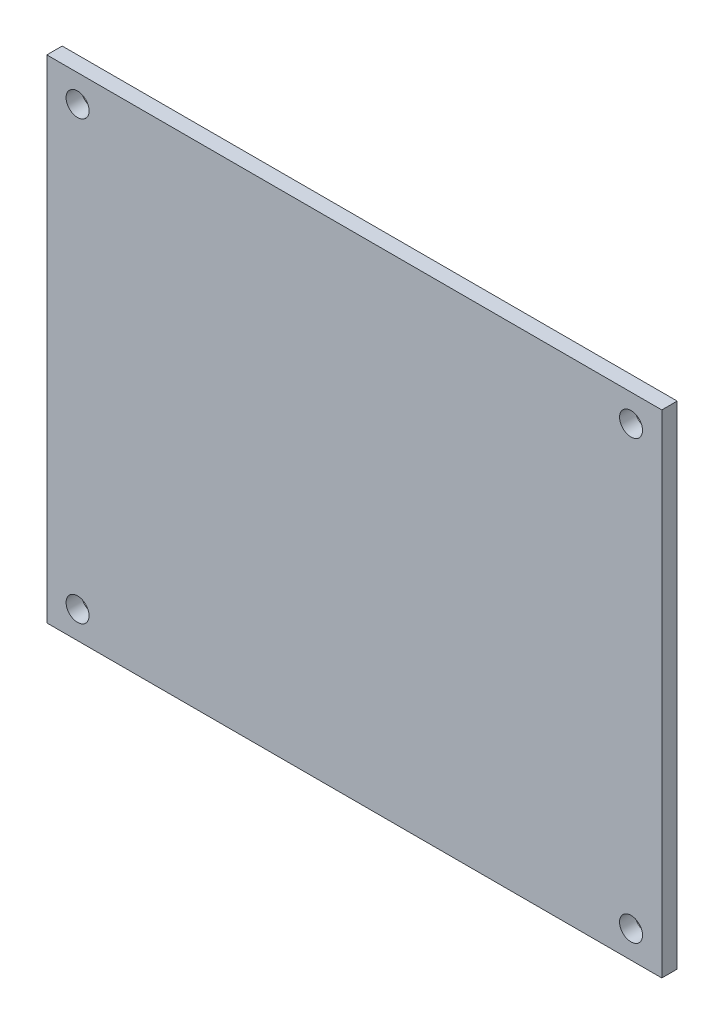
ISO-10303-21;
HEADER;
FILE_DESCRIPTION(('STEP AP214'),'2;1');
FILE_NAME('part.step','',(''),(''),'','','');
FILE_SCHEMA(('AUTOMOTIVE_DESIGN { 1 0 10303 214 1 1 1 1 }'));
ENDSEC;
DATA;
#1=APPLICATION_CONTEXT('core data for automotive mechanical design processes');
#2=APPLICATION_PROTOCOL_DEFINITION('international standard','automotive_design',2000,#1);
#3=PRODUCT_CONTEXT('',#1,'mechanical');
#4=PRODUCT('Part','Part','',(#3));
#5=PRODUCT_RELATED_PRODUCT_CATEGORY('part','',(#4));
#6=PRODUCT_DEFINITION_FORMATION('','',#4);
#7=PRODUCT_DEFINITION_CONTEXT('part definition',#1,'design');
#8=PRODUCT_DEFINITION('design','',#6,#7);
#9=PRODUCT_DEFINITION_SHAPE('','',#8);
#10=(LENGTH_UNIT() NAMED_UNIT(*) SI_UNIT(.MILLI.,.METRE.));
#11=(NAMED_UNIT(*) PLANE_ANGLE_UNIT() SI_UNIT($,.RADIAN.));
#12=(NAMED_UNIT(*) SI_UNIT($,.STERADIAN.) SOLID_ANGLE_UNIT());
#13=UNCERTAINTY_MEASURE_WITH_UNIT(LENGTH_MEASURE(1.E-05),#10,'distance_accuracy_value','');
#14=(GEOMETRIC_REPRESENTATION_CONTEXT(3) GLOBAL_UNCERTAINTY_ASSIGNED_CONTEXT((#13)) GLOBAL_UNIT_ASSIGNED_CONTEXT((#10,
#11,#12)) REPRESENTATION_CONTEXT('',''));
#15=CARTESIAN_POINT('',(0.,0.,0.));
#16=DIRECTION('',(0.,0.,1.));
#17=DIRECTION('',(1.,0.,0.));
#18=AXIS2_PLACEMENT_3D('',#15,#16,#17);
#19=CARTESIAN_POINT('',(127.,101.6,6.35));
#20=DIRECTION('',(-1.,0.,0.));
#21=DIRECTION('',(0.,-1.,0.));
#22=AXIS2_PLACEMENT_3D('',#19,#20,#21);
#23=PLANE('',#22);
#24=DIRECTION('',(0.,1.,0.));
#25=VECTOR('',#24,1.);
#26=CARTESIAN_POINT('',(127.,101.6,0.));
#27=LINE('',#26,#25);
#28=CARTESIAN_POINT('',(127.,-101.6,0.));
#29=VERTEX_POINT('',#28);
#30=CARTESIAN_POINT('',(127.,101.6,0.));
#31=VERTEX_POINT('',#30);
#32=EDGE_CURVE('E113',#29,#31,#27,.T.);
#33=ORIENTED_EDGE('',*,*,#32,.T.);
#34=DIRECTION('',(0.,0.,-1.));
#35=VECTOR('',#34,1.);
#36=CARTESIAN_POINT('',(127.,101.6,6.35));
#37=LINE('',#36,#35);
#38=CARTESIAN_POINT('',(127.,101.6,6.35));
#39=VERTEX_POINT('',#38);
#40=EDGE_CURVE('E11',#39,#31,#37,.T.);
#41=ORIENTED_EDGE('',*,*,#40,.F.);
#42=DIRECTION('',(0.,1.,0.));
#43=VECTOR('',#42,1.);
#44=CARTESIAN_POINT('',(127.,101.6,6.35));
#45=LINE('',#44,#43);
#46=CARTESIAN_POINT('',(127.,-101.6,6.35));
#47=VERTEX_POINT('',#46);
#48=EDGE_CURVE('E97',#47,#39,#45,.T.);
#49=ORIENTED_EDGE('',*,*,#48,.F.);
#50=DIRECTION('',(0.,0.,-1.));
#51=VECTOR('',#50,1.);
#52=CARTESIAN_POINT('',(127.,-101.6,6.35));
#53=LINE('',#52,#51);
#54=EDGE_CURVE('E112',#47,#29,#53,.T.);
#55=ORIENTED_EDGE('',*,*,#54,.T.);
#56=EDGE_LOOP('',(#33,#41,#49,#55));
#57=FACE_BOUND('',#56,.T.);
#58=ADVANCED_FACE('F50',(#57),#23,.F.);
#59=CARTESIAN_POINT('',(-127.,101.6,6.35));
#60=DIRECTION('',(0.,-1.,0.));
#61=DIRECTION('',(0.,0.,-1.));
#62=AXIS2_PLACEMENT_3D('',#59,#60,#61);
#63=PLANE('',#62);
#64=DIRECTION('',(-1.,0.,0.));
#65=VECTOR('',#64,1.);
#66=CARTESIAN_POINT('',(-127.,101.6,0.));
#67=LINE('',#66,#65);
#68=CARTESIAN_POINT('',(-127.,101.6,0.));
#69=VERTEX_POINT('',#68);
#70=EDGE_CURVE('E102',#31,#69,#67,.T.);
#71=ORIENTED_EDGE('',*,*,#70,.T.);
#72=DIRECTION('',(0.,0.,-1.));
#73=VECTOR('',#72,1.);
#74=CARTESIAN_POINT('',(-127.,101.6,6.35));
#75=LINE('',#74,#73);
#76=CARTESIAN_POINT('',(-127.,101.6,6.35));
#77=VERTEX_POINT('',#76);
#78=EDGE_CURVE('E57',#77,#69,#75,.T.);
#79=ORIENTED_EDGE('',*,*,#78,.F.);
#80=DIRECTION('',(-1.,0.,0.));
#81=VECTOR('',#80,1.);
#82=CARTESIAN_POINT('',(-127.,101.6,6.35));
#83=LINE('',#82,#81);
#84=EDGE_CURVE('E94',#39,#77,#83,.T.);
#85=ORIENTED_EDGE('',*,*,#84,.F.);
#86=ORIENTED_EDGE('',*,*,#40,.T.);
#87=EDGE_LOOP('',(#71,#79,#85,#86));
#88=FACE_BOUND('',#87,.T.);
#89=ADVANCED_FACE('F103',(#88),#63,.F.);
#90=CARTESIAN_POINT('',(-127.,101.6,6.35));
#91=DIRECTION('',(1.,0.,0.));
#92=DIRECTION('',(0.,0.,-1.));
#93=AXIS2_PLACEMENT_3D('',#90,#91,#92);
#94=PLANE('',#93);
#95=DIRECTION('',(0.,-1.,0.));
#96=VECTOR('',#95,1.);
#97=CARTESIAN_POINT('',(-127.,101.6,0.));
#98=LINE('',#97,#96);
#99=CARTESIAN_POINT('',(-127.,-101.6,0.));
#100=VERTEX_POINT('',#99);
#101=EDGE_CURVE('E81',#69,#100,#98,.T.);
#102=ORIENTED_EDGE('',*,*,#101,.T.);
#103=DIRECTION('',(0.,0.,-1.));
#104=VECTOR('',#103,1.);
#105=CARTESIAN_POINT('',(-127.,-101.6,6.35));
#106=LINE('',#105,#104);
#107=CARTESIAN_POINT('',(-127.,-101.6,6.35));
#108=VERTEX_POINT('',#107);
#109=EDGE_CURVE('E106',#108,#100,#106,.T.);
#110=ORIENTED_EDGE('',*,*,#109,.F.);
#111=DIRECTION('',(0.,-1.,0.));
#112=VECTOR('',#111,1.);
#113=CARTESIAN_POINT('',(-127.,101.6,6.35));
#114=LINE('',#113,#112);
#115=EDGE_CURVE('E100',#77,#108,#114,.T.);
#116=ORIENTED_EDGE('',*,*,#115,.F.);
#117=ORIENTED_EDGE('',*,*,#78,.T.);
#118=EDGE_LOOP('',(#102,#110,#116,#117));
#119=FACE_BOUND('',#118,.T.);
#120=ADVANCED_FACE('F110',(#119),#94,.F.);
#121=CARTESIAN_POINT('',(-127.,-101.6,6.35));
#122=DIRECTION('',(0.,1.,0.));
#123=DIRECTION('',(0.,0.,1.));
#124=AXIS2_PLACEMENT_3D('',#121,#122,#123);
#125=PLANE('',#124);
#126=DIRECTION('',(1.,0.,0.));
#127=VECTOR('',#126,1.);
#128=CARTESIAN_POINT('',(-127.,-101.6,0.));
#129=LINE('',#128,#127);
#130=EDGE_CURVE('E87',#100,#29,#129,.T.);
#131=ORIENTED_EDGE('',*,*,#130,.T.);
#132=ORIENTED_EDGE('',*,*,#54,.F.);
#133=DIRECTION('',(1.,0.,0.));
#134=VECTOR('',#133,1.);
#135=CARTESIAN_POINT('',(-127.,-101.6,6.35));
#136=LINE('',#135,#134);
#137=EDGE_CURVE('E63',#108,#47,#136,.T.);
#138=ORIENTED_EDGE('',*,*,#137,.F.);
#139=ORIENTED_EDGE('',*,*,#109,.T.);
#140=EDGE_LOOP('',(#131,#132,#138,#139));
#141=FACE_BOUND('',#140,.T.);
#142=ADVANCED_FACE('F129',(#141),#125,.F.);
#143=CARTESIAN_POINT('',(0.,0.,6.35));
#144=DIRECTION('',(0.,0.,1.));
#145=DIRECTION('',(1.,0.,0.));
#146=AXIS2_PLACEMENT_3D('',#143,#144,#145);
#147=PLANE('',#146);
#148=CARTESIAN_POINT('',(-114.3,-90.297,6.35));
#149=DIRECTION('',(0.,0.,1.));
#150=DIRECTION('',(-1.,0.,0.));
#151=AXIS2_PLACEMENT_3D('',#148,#149,#150);
#152=CIRCLE('',#151,4.74979999999999);
#153=CARTESIAN_POINT('',(-119.0498,-90.297,6.35));
#154=VERTEX_POINT('',#153);
#155=EDGE_CURVE('E139',#154,#154,#152,.T.);
#156=ORIENTED_EDGE('',*,*,#155,.F.);
#157=EDGE_LOOP('',(#156));
#158=FACE_BOUND('',#157,.T.);
#159=CARTESIAN_POINT('',(114.3,90.297,6.35));
#160=DIRECTION('',(0.,0.,1.));
#161=DIRECTION('',(-1.,0.,0.));
#162=AXIS2_PLACEMENT_3D('',#159,#160,#161);
#163=CIRCLE('',#162,4.74979999999999);
#164=CARTESIAN_POINT('',(109.5502,90.297,6.35));
#165=VERTEX_POINT('',#164);
#166=EDGE_CURVE('E146',#165,#165,#163,.T.);
#167=ORIENTED_EDGE('',*,*,#166,.F.);
#168=EDGE_LOOP('',(#167));
#169=FACE_BOUND('',#168,.T.);
#170=CARTESIAN_POINT('',(-114.3,90.297,6.35));
#171=DIRECTION('',(0.,0.,1.));
#172=DIRECTION('',(1.,0.,0.));
#173=AXIS2_PLACEMENT_3D('',#170,#171,#172);
#174=CIRCLE('',#173,4.74979999999999);
#175=CARTESIAN_POINT('',(-109.5502,90.297,6.35));
#176=VERTEX_POINT('',#175);
#177=EDGE_CURVE('E149',#176,#176,#174,.T.);
#178=ORIENTED_EDGE('',*,*,#177,.F.);
#179=EDGE_LOOP('',(#178));
#180=FACE_BOUND('',#179,.T.);
#181=CARTESIAN_POINT('',(114.3,-90.297,6.35));
#182=DIRECTION('',(0.,0.,1.));
#183=DIRECTION('',(1.,0.,0.));
#184=AXIS2_PLACEMENT_3D('',#181,#182,#183);
#185=CIRCLE('',#184,4.74979999999999);
#186=CARTESIAN_POINT('',(119.0498,-90.297,6.35));
#187=VERTEX_POINT('',#186);
#188=EDGE_CURVE('E136',#187,#187,#185,.T.);
#189=ORIENTED_EDGE('',*,*,#188,.F.);
#190=EDGE_LOOP('',(#189));
#191=FACE_BOUND('',#190,.T.);
#192=ORIENTED_EDGE('',*,*,#48,.T.);
#193=ORIENTED_EDGE('',*,*,#84,.T.);
#194=ORIENTED_EDGE('',*,*,#115,.T.);
#195=ORIENTED_EDGE('',*,*,#137,.T.);
#196=EDGE_LOOP('',(#192,#193,#194,#195));
#197=FACE_BOUND('',#196,.T.);
#198=ADVANCED_FACE('F92',(#158,#169,#180,#191,#197),#147,.T.);
#199=CARTESIAN_POINT('',(0.,0.,0.));
#200=DIRECTION('',(0.,0.,1.));
#201=DIRECTION('',(1.,0.,0.));
#202=AXIS2_PLACEMENT_3D('',#199,#200,#201);
#203=PLANE('',#202);
#204=CARTESIAN_POINT('',(-114.3,-90.297,0.));
#205=DIRECTION('',(0.,0.,1.));
#206=DIRECTION('',(-1.,0.,0.));
#207=AXIS2_PLACEMENT_3D('',#204,#205,#206);
#208=CIRCLE('',#207,4.74979999999999);
#209=CARTESIAN_POINT('',(-119.0498,-90.297,0.));
#210=VERTEX_POINT('',#209);
#211=EDGE_CURVE('E153',#210,#210,#208,.T.);
#212=ORIENTED_EDGE('',*,*,#211,.T.);
#213=EDGE_LOOP('',(#212));
#214=FACE_BOUND('',#213,.T.);
#215=CARTESIAN_POINT('',(114.3,90.297,0.));
#216=DIRECTION('',(0.,0.,1.));
#217=DIRECTION('',(-1.,0.,0.));
#218=AXIS2_PLACEMENT_3D('',#215,#216,#217);
#219=CIRCLE('',#218,4.74979999999999);
#220=CARTESIAN_POINT('',(109.5502,90.297,0.));
#221=VERTEX_POINT('',#220);
#222=EDGE_CURVE('E145',#221,#221,#219,.T.);
#223=ORIENTED_EDGE('',*,*,#222,.T.);
#224=EDGE_LOOP('',(#223));
#225=FACE_BOUND('',#224,.T.);
#226=CARTESIAN_POINT('',(-114.3,90.297,0.));
#227=DIRECTION('',(0.,0.,1.));
#228=DIRECTION('',(1.,0.,0.));
#229=AXIS2_PLACEMENT_3D('',#226,#227,#228);
#230=CIRCLE('',#229,4.74979999999999);
#231=CARTESIAN_POINT('',(-109.5502,90.297,0.));
#232=VERTEX_POINT('',#231);
#233=EDGE_CURVE('E159',#232,#232,#230,.T.);
#234=ORIENTED_EDGE('',*,*,#233,.T.);
#235=EDGE_LOOP('',(#234));
#236=FACE_BOUND('',#235,.T.);
#237=CARTESIAN_POINT('',(114.3,-90.297,0.));
#238=DIRECTION('',(0.,0.,1.));
#239=DIRECTION('',(1.,0.,0.));
#240=AXIS2_PLACEMENT_3D('',#237,#238,#239);
#241=CIRCLE('',#240,4.74979999999999);
#242=CARTESIAN_POINT('',(119.0498,-90.297,0.));
#243=VERTEX_POINT('',#242);
#244=EDGE_CURVE('E118',#243,#243,#241,.T.);
#245=ORIENTED_EDGE('',*,*,#244,.T.);
#246=EDGE_LOOP('',(#245));
#247=FACE_BOUND('',#246,.T.);
#248=ORIENTED_EDGE('',*,*,#32,.F.);
#249=ORIENTED_EDGE('',*,*,#130,.F.);
#250=ORIENTED_EDGE('',*,*,#101,.F.);
#251=ORIENTED_EDGE('',*,*,#70,.F.);
#252=EDGE_LOOP('',(#248,#249,#250,#251));
#253=FACE_BOUND('',#252,.T.);
#254=ADVANCED_FACE('F135',(#214,#225,#236,#247,#253),#203,.F.);
#255=CARTESIAN_POINT('',(114.3,-90.297,0.));
#256=DIRECTION('',(0.,0.,1.));
#257=DIRECTION('',(1.,0.,0.));
#258=AXIS2_PLACEMENT_3D('',#255,#256,#257);
#259=CYLINDRICAL_SURFACE('',#258,4.74979999999999);
#260=ORIENTED_EDGE('',*,*,#244,.F.);
#261=EDGE_LOOP('',(#260));
#262=FACE_BOUND('',#261,.T.);
#263=ORIENTED_EDGE('',*,*,#188,.T.);
#264=EDGE_LOOP('',(#263));
#265=FACE_BOUND('',#264,.T.);
#266=ADVANCED_FACE('F176',(#262,#265),#259,.F.);
#267=CARTESIAN_POINT('',(-114.3,90.297,0.));
#268=DIRECTION('',(0.,0.,1.));
#269=DIRECTION('',(1.,0.,0.));
#270=AXIS2_PLACEMENT_3D('',#267,#268,#269);
#271=CYLINDRICAL_SURFACE('',#270,4.74979999999999);
#272=ORIENTED_EDGE('',*,*,#233,.F.);
#273=EDGE_LOOP('',(#272));
#274=FACE_BOUND('',#273,.T.);
#275=ORIENTED_EDGE('',*,*,#177,.T.);
#276=EDGE_LOOP('',(#275));
#277=FACE_BOUND('',#276,.T.);
#278=ADVANCED_FACE('F169',(#274,#277),#271,.F.);
#279=CARTESIAN_POINT('',(114.3,90.297,0.));
#280=DIRECTION('',(0.,0.,1.));
#281=DIRECTION('',(1.,0.,0.));
#282=AXIS2_PLACEMENT_3D('',#279,#280,#281);
#283=CYLINDRICAL_SURFACE('',#282,4.74979999999999);
#284=ORIENTED_EDGE('',*,*,#222,.F.);
#285=EDGE_LOOP('',(#284));
#286=FACE_BOUND('',#285,.T.);
#287=ORIENTED_EDGE('',*,*,#166,.T.);
#288=EDGE_LOOP('',(#287));
#289=FACE_BOUND('',#288,.T.);
#290=ADVANCED_FACE('F184',(#286,#289),#283,.F.);
#291=CARTESIAN_POINT('',(-114.3,-90.297,0.));
#292=DIRECTION('',(0.,0.,1.));
#293=DIRECTION('',(1.,0.,0.));
#294=AXIS2_PLACEMENT_3D('',#291,#292,#293);
#295=CYLINDRICAL_SURFACE('',#294,4.74979999999999);
#296=ORIENTED_EDGE('',*,*,#211,.F.);
#297=EDGE_LOOP('',(#296));
#298=FACE_BOUND('',#297,.T.);
#299=ORIENTED_EDGE('',*,*,#155,.T.);
#300=EDGE_LOOP('',(#299));
#301=FACE_BOUND('',#300,.T.);
#302=ADVANCED_FACE('F234',(#298,#301),#295,.F.);
#303=CLOSED_SHELL('',(#58,#89,#120,#142,#198,#254,#266,#278,#290,#302));
#304=MANIFOLD_SOLID_BREP('B2',#303);
#305=ADVANCED_BREP_SHAPE_REPRESENTATION('',(#18,#304),#14);
#306=SHAPE_DEFINITION_REPRESENTATION(#9,#305);
ENDSEC;
END-ISO-10303-21;
